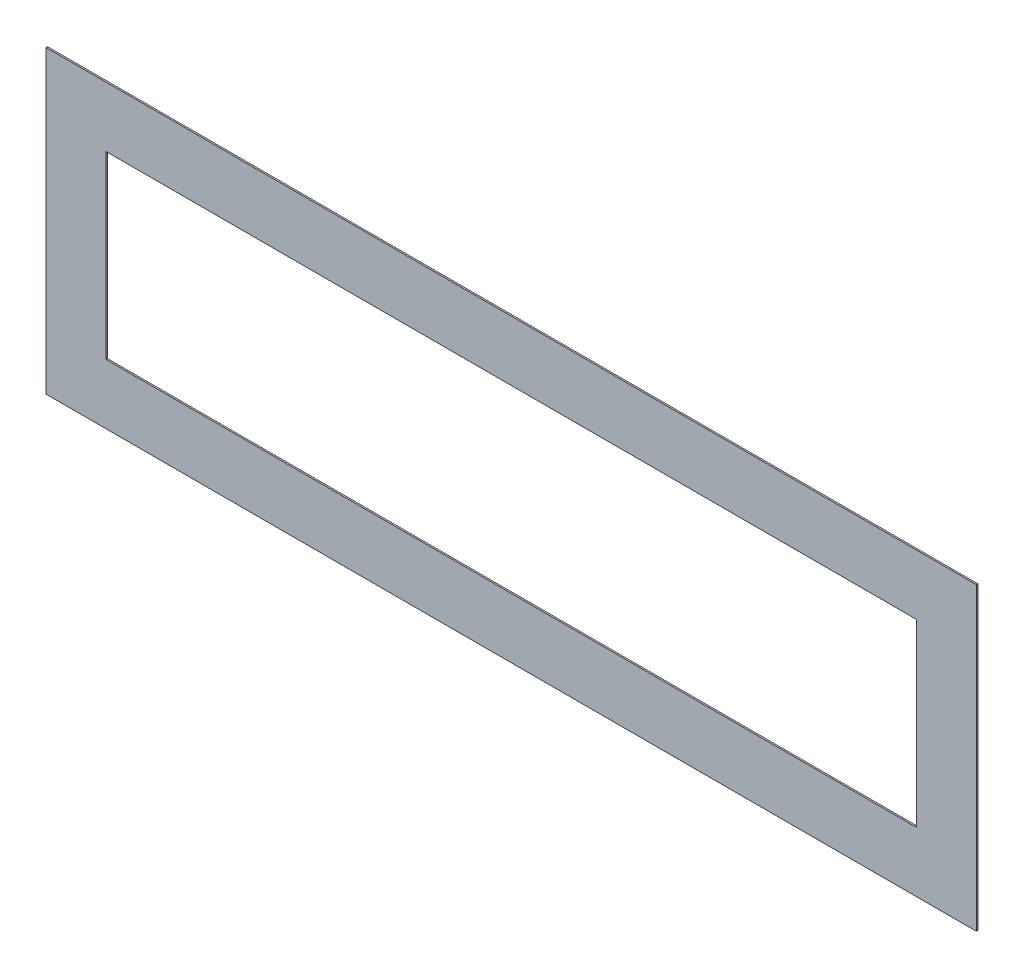
ISO-10303-21;
HEADER;
FILE_DESCRIPTION(('STEP AP214'),'2;1');
FILE_NAME('part.step','',(''),(''),'','','');
FILE_SCHEMA(('AUTOMOTIVE_DESIGN { 1 0 10303 214 1 1 1 1 }'));
ENDSEC;
DATA;
#1=APPLICATION_CONTEXT('core data for automotive mechanical design processes');
#2=APPLICATION_PROTOCOL_DEFINITION('international standard','automotive_design',2000,#1);
#3=PRODUCT_CONTEXT('',#1,'mechanical');
#4=PRODUCT('Part','Part','',(#3));
#5=PRODUCT_RELATED_PRODUCT_CATEGORY('part','',(#4));
#6=PRODUCT_DEFINITION_FORMATION('','',#4);
#7=PRODUCT_DEFINITION_CONTEXT('part definition',#1,'design');
#8=PRODUCT_DEFINITION('design','',#6,#7);
#9=PRODUCT_DEFINITION_SHAPE('','',#8);
#10=(LENGTH_UNIT() NAMED_UNIT(*) SI_UNIT(.MILLI.,.METRE.));
#11=(NAMED_UNIT(*) PLANE_ANGLE_UNIT() SI_UNIT($,.RADIAN.));
#12=(NAMED_UNIT(*) SI_UNIT($,.STERADIAN.) SOLID_ANGLE_UNIT());
#13=UNCERTAINTY_MEASURE_WITH_UNIT(LENGTH_MEASURE(1.E-05),#10,'distance_accuracy_value','');
#14=(GEOMETRIC_REPRESENTATION_CONTEXT(3) GLOBAL_UNCERTAINTY_ASSIGNED_CONTEXT((#13)) GLOBAL_UNIT_ASSIGNED_CONTEXT((#10,
#11,#12)) REPRESENTATION_CONTEXT('',''));
#15=CARTESIAN_POINT('',(0.,0.,0.));
#16=DIRECTION('',(0.,0.,1.));
#17=DIRECTION('',(1.,0.,0.));
#18=AXIS2_PLACEMENT_3D('',#15,#16,#17);
#19=CARTESIAN_POINT('',(685.800000000002,273.308597285067,0.));
#20=DIRECTION('',(1.,0.,0.));
#21=DIRECTION('',(0.,0.,-1.));
#22=AXIS2_PLACEMENT_3D('',#19,#20,#21);
#23=PLANE('',#22);
#24=DIRECTION('',(0.,1.,0.));
#25=VECTOR('',#24,1.);
#26=CARTESIAN_POINT('',(685.800000000002,273.308597285067,0.));
#27=LINE('',#26,#25);
#28=CARTESIAN_POINT('',(685.800000000002,273.308597285067,0.));
#29=VERTEX_POINT('',#28);
#30=CARTESIAN_POINT('',(685.800000000002,578.108597285064,0.));
#31=VERTEX_POINT('',#30);
#32=EDGE_CURVE('E34',#29,#31,#27,.T.);
#33=ORIENTED_EDGE('',*,*,#32,.F.);
#34=DIRECTION('',(0.,0.,1.));
#35=VECTOR('',#34,1.);
#36=CARTESIAN_POINT('',(685.800000000002,273.308597285067,0.));
#37=LINE('',#36,#35);
#38=CARTESIAN_POINT('',(685.800000000002,273.308597285067,2.54));
#39=VERTEX_POINT('',#38);
#40=EDGE_CURVE('E10',#29,#39,#37,.T.);
#41=ORIENTED_EDGE('',*,*,#40,.T.);
#42=DIRECTION('',(0.,-1.,0.));
#43=VECTOR('',#42,1.);
#44=CARTESIAN_POINT('',(685.800000000002,578.108597285064,2.54));
#45=LINE('',#44,#43);
#46=CARTESIAN_POINT('',(685.800000000002,578.108597285064,2.54));
#47=VERTEX_POINT('',#46);
#48=EDGE_CURVE('E109',#47,#39,#45,.T.);
#49=ORIENTED_EDGE('',*,*,#48,.F.);
#50=DIRECTION('',(0.,0.,1.));
#51=VECTOR('',#50,1.);
#52=CARTESIAN_POINT('',(685.800000000002,578.108597285064,0.));
#53=LINE('',#52,#51);
#54=EDGE_CURVE('E114',#31,#47,#53,.T.);
#55=ORIENTED_EDGE('',*,*,#54,.F.);
#56=EDGE_LOOP('',(#33,#41,#49,#55));
#57=FACE_BOUND('',#56,.T.);
#58=ADVANCED_FACE('F16',(#57),#23,.F.);
#59=CARTESIAN_POINT('',(-685.799999999999,273.308597285067,0.));
#60=DIRECTION('',(0.,-1.,0.));
#61=DIRECTION('',(0.,0.,-1.));
#62=AXIS2_PLACEMENT_3D('',#59,#60,#61);
#63=PLANE('',#62);
#64=DIRECTION('',(1.,0.,0.));
#65=VECTOR('',#64,1.);
#66=CARTESIAN_POINT('',(-685.799999999999,273.308597285067,0.));
#67=LINE('',#66,#65);
#68=CARTESIAN_POINT('',(-685.799999999999,273.308597285067,0.));
#69=VERTEX_POINT('',#68);
#70=EDGE_CURVE('E172',#69,#29,#67,.T.);
#71=ORIENTED_EDGE('',*,*,#70,.F.);
#72=DIRECTION('',(0.,0.,1.));
#73=VECTOR('',#72,1.);
#74=CARTESIAN_POINT('',(-685.799999999999,273.308597285067,0.));
#75=LINE('',#74,#73);
#76=CARTESIAN_POINT('',(-685.799999999998,273.308597285067,2.54));
#77=VERTEX_POINT('',#76);
#78=EDGE_CURVE('E26',#69,#77,#75,.T.);
#79=ORIENTED_EDGE('',*,*,#78,.T.);
#80=DIRECTION('',(-1.,0.,0.));
#81=VECTOR('',#80,1.);
#82=CARTESIAN_POINT('',(685.800000000002,273.308597285067,2.54));
#83=LINE('',#82,#81);
#84=EDGE_CURVE('E176',#39,#77,#83,.T.);
#85=ORIENTED_EDGE('',*,*,#84,.F.);
#86=ORIENTED_EDGE('',*,*,#40,.F.);
#87=EDGE_LOOP('',(#71,#79,#85,#86));
#88=FACE_BOUND('',#87,.T.);
#89=ADVANCED_FACE('F146',(#88),#63,.F.);
#90=CARTESIAN_POINT('',(-685.799999999999,578.108597285064,0.));
#91=DIRECTION('',(-1.,0.,0.));
#92=DIRECTION('',(0.,0.,1.));
#93=AXIS2_PLACEMENT_3D('',#90,#91,#92);
#94=PLANE('',#93);
#95=DIRECTION('',(0.,-1.,0.));
#96=VECTOR('',#95,1.);
#97=CARTESIAN_POINT('',(-685.799999999999,578.108597285064,0.));
#98=LINE('',#97,#96);
#99=CARTESIAN_POINT('',(-685.799999999999,578.108597285064,0.));
#100=VERTEX_POINT('',#99);
#101=EDGE_CURVE('E169',#100,#69,#98,.T.);
#102=ORIENTED_EDGE('',*,*,#101,.F.);
#103=DIRECTION('',(0.,0.,1.));
#104=VECTOR('',#103,1.);
#105=CARTESIAN_POINT('',(-685.799999999999,578.108597285064,0.));
#106=LINE('',#105,#104);
#107=CARTESIAN_POINT('',(-685.799999999998,578.108597285064,2.54));
#108=VERTEX_POINT('',#107);
#109=EDGE_CURVE('E118',#100,#108,#106,.T.);
#110=ORIENTED_EDGE('',*,*,#109,.T.);
#111=DIRECTION('',(0.,1.,0.));
#112=VECTOR('',#111,1.);
#113=CARTESIAN_POINT('',(-685.799999999999,273.308597285067,2.54));
#114=LINE('',#113,#112);
#115=EDGE_CURVE('E130',#77,#108,#114,.T.);
#116=ORIENTED_EDGE('',*,*,#115,.F.);
#117=ORIENTED_EDGE('',*,*,#78,.F.);
#118=EDGE_LOOP('',(#102,#110,#116,#117));
#119=FACE_BOUND('',#118,.T.);
#120=ADVANCED_FACE('F151',(#119),#94,.F.);
#121=CARTESIAN_POINT('',(685.800000000002,578.108597285064,0.));
#122=DIRECTION('',(0.,1.,0.));
#123=DIRECTION('',(0.,0.,1.));
#124=AXIS2_PLACEMENT_3D('',#121,#122,#123);
#125=PLANE('',#124);
#126=DIRECTION('',(-1.,0.,0.));
#127=VECTOR('',#126,1.);
#128=CARTESIAN_POINT('',(685.800000000002,578.108597285064,0.));
#129=LINE('',#128,#127);
#130=EDGE_CURVE('E165',#31,#100,#129,.T.);
#131=ORIENTED_EDGE('',*,*,#130,.F.);
#132=ORIENTED_EDGE('',*,*,#54,.T.);
#133=DIRECTION('',(1.,0.,0.));
#134=VECTOR('',#133,1.);
#135=CARTESIAN_POINT('',(-685.799999999998,578.108597285064,2.54));
#136=LINE('',#135,#134);
#137=EDGE_CURVE('E128',#108,#47,#136,.T.);
#138=ORIENTED_EDGE('',*,*,#137,.F.);
#139=ORIENTED_EDGE('',*,*,#109,.F.);
#140=EDGE_LOOP('',(#131,#132,#138,#139));
#141=FACE_BOUND('',#140,.T.);
#142=ADVANCED_FACE('F143',(#141),#125,.F.);
#143=CARTESIAN_POINT('',(-787.399999999999,679.708597285064,0.));
#144=DIRECTION('',(-1.,0.,0.));
#145=DIRECTION('',(0.,0.,1.));
#146=AXIS2_PLACEMENT_3D('',#143,#144,#145);
#147=PLANE('',#146);
#148=DIRECTION('',(0.,1.,0.));
#149=VECTOR('',#148,1.);
#150=CARTESIAN_POINT('',(-787.399999999999,171.708597285067,0.));
#151=LINE('',#150,#149);
#152=CARTESIAN_POINT('',(-787.399999999999,171.708597285067,0.));
#153=VERTEX_POINT('',#152);
#154=CARTESIAN_POINT('',(-787.399999999999,679.708597285064,0.));
#155=VERTEX_POINT('',#154);
#156=EDGE_CURVE('E113',#153,#155,#151,.T.);
#157=ORIENTED_EDGE('',*,*,#156,.F.);
#158=DIRECTION('',(0.,0.,1.));
#159=VECTOR('',#158,1.);
#160=CARTESIAN_POINT('',(-787.399999999999,171.708597285067,0.));
#161=LINE('',#160,#159);
#162=CARTESIAN_POINT('',(-787.399999999999,171.708597285067,2.54));
#163=VERTEX_POINT('',#162);
#164=EDGE_CURVE('E111',#153,#163,#161,.T.);
#165=ORIENTED_EDGE('',*,*,#164,.T.);
#166=DIRECTION('',(0.,-1.,0.));
#167=VECTOR('',#166,1.);
#168=CARTESIAN_POINT('',(-787.399999999999,679.708597285064,2.54));
#169=LINE('',#168,#167);
#170=CARTESIAN_POINT('',(-787.399999999999,679.708597285064,2.54));
#171=VERTEX_POINT('',#170);
#172=EDGE_CURVE('E104',#171,#163,#169,.T.);
#173=ORIENTED_EDGE('',*,*,#172,.F.);
#174=DIRECTION('',(0.,0.,1.));
#175=VECTOR('',#174,1.);
#176=CARTESIAN_POINT('',(-787.399999999999,679.708597285064,0.));
#177=LINE('',#176,#175);
#178=EDGE_CURVE('E115',#155,#171,#177,.T.);
#179=ORIENTED_EDGE('',*,*,#178,.F.);
#180=EDGE_LOOP('',(#157,#165,#173,#179));
#181=FACE_BOUND('',#180,.T.);
#182=ADVANCED_FACE('F112',(#181),#147,.T.);
#183=CARTESIAN_POINT('',(787.400000000003,679.708597285064,0.));
#184=DIRECTION('',(0.,1.,0.));
#185=DIRECTION('',(0.,0.,1.));
#186=AXIS2_PLACEMENT_3D('',#183,#184,#185);
#187=PLANE('',#186);
#188=DIRECTION('',(1.,0.,0.));
#189=VECTOR('',#188,1.);
#190=CARTESIAN_POINT('',(-787.399999999999,679.708597285064,0.));
#191=LINE('',#190,#189);
#192=CARTESIAN_POINT('',(787.400000000002,679.708597285064,0.));
#193=VERTEX_POINT('',#192);
#194=EDGE_CURVE('E124',#155,#193,#191,.T.);
#195=ORIENTED_EDGE('',*,*,#194,.F.);
#196=ORIENTED_EDGE('',*,*,#178,.T.);
#197=DIRECTION('',(-1.,0.,0.));
#198=VECTOR('',#197,1.);
#199=CARTESIAN_POINT('',(787.400000000002,679.708597285064,2.54));
#200=LINE('',#199,#198);
#201=CARTESIAN_POINT('',(787.400000000002,679.708597285064,2.54));
#202=VERTEX_POINT('',#201);
#203=EDGE_CURVE('E94',#202,#171,#200,.T.);
#204=ORIENTED_EDGE('',*,*,#203,.F.);
#205=DIRECTION('',(0.,0.,1.));
#206=VECTOR('',#205,1.);
#207=CARTESIAN_POINT('',(787.400000000002,679.708597285064,0.));
#208=LINE('',#207,#206);
#209=EDGE_CURVE('E90',#193,#202,#208,.T.);
#210=ORIENTED_EDGE('',*,*,#209,.F.);
#211=EDGE_LOOP('',(#195,#196,#204,#210));
#212=FACE_BOUND('',#211,.T.);
#213=ADVANCED_FACE('F134',(#212),#187,.T.);
#214=CARTESIAN_POINT('',(787.400000000003,171.708597285067,0.));
#215=DIRECTION('',(1.,0.,0.));
#216=DIRECTION('',(0.,0.,-1.));
#217=AXIS2_PLACEMENT_3D('',#214,#215,#216);
#218=PLANE('',#217);
#219=DIRECTION('',(0.,-1.,0.));
#220=VECTOR('',#219,1.);
#221=CARTESIAN_POINT('',(787.400000000002,679.708597285064,0.));
#222=LINE('',#221,#220);
#223=CARTESIAN_POINT('',(787.400000000003,171.708597285067,0.));
#224=VERTEX_POINT('',#223);
#225=EDGE_CURVE('E78',#193,#224,#222,.T.);
#226=ORIENTED_EDGE('',*,*,#225,.F.);
#227=ORIENTED_EDGE('',*,*,#209,.T.);
#228=DIRECTION('',(0.,1.,0.));
#229=VECTOR('',#228,1.);
#230=CARTESIAN_POINT('',(787.400000000003,171.708597285067,2.54));
#231=LINE('',#230,#229);
#232=CARTESIAN_POINT('',(787.400000000003,171.708597285067,2.54));
#233=VERTEX_POINT('',#232);
#234=EDGE_CURVE('E84',#233,#202,#231,.T.);
#235=ORIENTED_EDGE('',*,*,#234,.F.);
#236=DIRECTION('',(0.,0.,1.));
#237=VECTOR('',#236,1.);
#238=CARTESIAN_POINT('',(787.400000000003,171.708597285067,0.));
#239=LINE('',#238,#237);
#240=EDGE_CURVE('E87',#224,#233,#239,.T.);
#241=ORIENTED_EDGE('',*,*,#240,.F.);
#242=EDGE_LOOP('',(#226,#227,#235,#241));
#243=FACE_BOUND('',#242,.T.);
#244=ADVANCED_FACE('F86',(#243),#218,.T.);
#245=CARTESIAN_POINT('',(-787.399999999999,171.708597285067,0.));
#246=DIRECTION('',(0.,-1.,0.));
#247=DIRECTION('',(0.,0.,-1.));
#248=AXIS2_PLACEMENT_3D('',#245,#246,#247);
#249=PLANE('',#248);
#250=DIRECTION('',(-1.,0.,0.));
#251=VECTOR('',#250,1.);
#252=CARTESIAN_POINT('',(787.400000000003,171.708597285067,0.));
#253=LINE('',#252,#251);
#254=EDGE_CURVE('E100',#224,#153,#253,.T.);
#255=ORIENTED_EDGE('',*,*,#254,.F.);
#256=ORIENTED_EDGE('',*,*,#240,.T.);
#257=DIRECTION('',(1.,0.,0.));
#258=VECTOR('',#257,1.);
#259=CARTESIAN_POINT('',(-787.399999999999,171.708597285067,2.54));
#260=LINE('',#259,#258);
#261=EDGE_CURVE('E20',#163,#233,#260,.T.);
#262=ORIENTED_EDGE('',*,*,#261,.F.);
#263=ORIENTED_EDGE('',*,*,#164,.F.);
#264=EDGE_LOOP('',(#255,#256,#262,#263));
#265=FACE_BOUND('',#264,.T.);
#266=ADVANCED_FACE('F98',(#265),#249,.T.);
#267=CARTESIAN_POINT('',(1.735760308E-12,425.708597285065,2.54));
#268=DIRECTION('',(0.,0.,-1.));
#269=DIRECTION('',(-1.,0.,0.));
#270=AXIS2_PLACEMENT_3D('',#267,#268,#269);
#271=PLANE('',#270);
#272=ORIENTED_EDGE('',*,*,#261,.T.);
#273=ORIENTED_EDGE('',*,*,#234,.T.);
#274=ORIENTED_EDGE('',*,*,#203,.T.);
#275=ORIENTED_EDGE('',*,*,#172,.T.);
#276=EDGE_LOOP('',(#272,#273,#274,#275));
#277=FACE_BOUND('',#276,.T.);
#278=ORIENTED_EDGE('',*,*,#48,.T.);
#279=ORIENTED_EDGE('',*,*,#84,.T.);
#280=ORIENTED_EDGE('',*,*,#115,.T.);
#281=ORIENTED_EDGE('',*,*,#137,.T.);
#282=EDGE_LOOP('',(#278,#279,#280,#281));
#283=FACE_BOUND('',#282,.T.);
#284=ADVANCED_FACE('F102',(#277,#283),#271,.F.);
#285=CARTESIAN_POINT('',(1.735760308E-12,425.708597285065,0.));
#286=DIRECTION('',(0.,0.,-1.));
#287=DIRECTION('',(-1.,0.,0.));
#288=AXIS2_PLACEMENT_3D('',#285,#286,#287);
#289=PLANE('',#288);
#290=ORIENTED_EDGE('',*,*,#254,.T.);
#291=ORIENTED_EDGE('',*,*,#156,.T.);
#292=ORIENTED_EDGE('',*,*,#194,.T.);
#293=ORIENTED_EDGE('',*,*,#225,.T.);
#294=EDGE_LOOP('',(#290,#291,#292,#293));
#295=FACE_BOUND('',#294,.T.);
#296=ORIENTED_EDGE('',*,*,#32,.T.);
#297=ORIENTED_EDGE('',*,*,#130,.T.);
#298=ORIENTED_EDGE('',*,*,#101,.T.);
#299=ORIENTED_EDGE('',*,*,#70,.T.);
#300=EDGE_LOOP('',(#296,#297,#298,#299));
#301=FACE_BOUND('',#300,.T.);
#302=ADVANCED_FACE('F18',(#295,#301),#289,.T.);
#303=CLOSED_SHELL('',(#58,#89,#120,#142,#182,#213,#244,#266,#284,#302));
#304=MANIFOLD_SOLID_BREP('B1',#303);
#305=ADVANCED_BREP_SHAPE_REPRESENTATION('',(#18,#304),#14);
#306=SHAPE_DEFINITION_REPRESENTATION(#9,#305);
ENDSEC;
END-ISO-10303-21;
